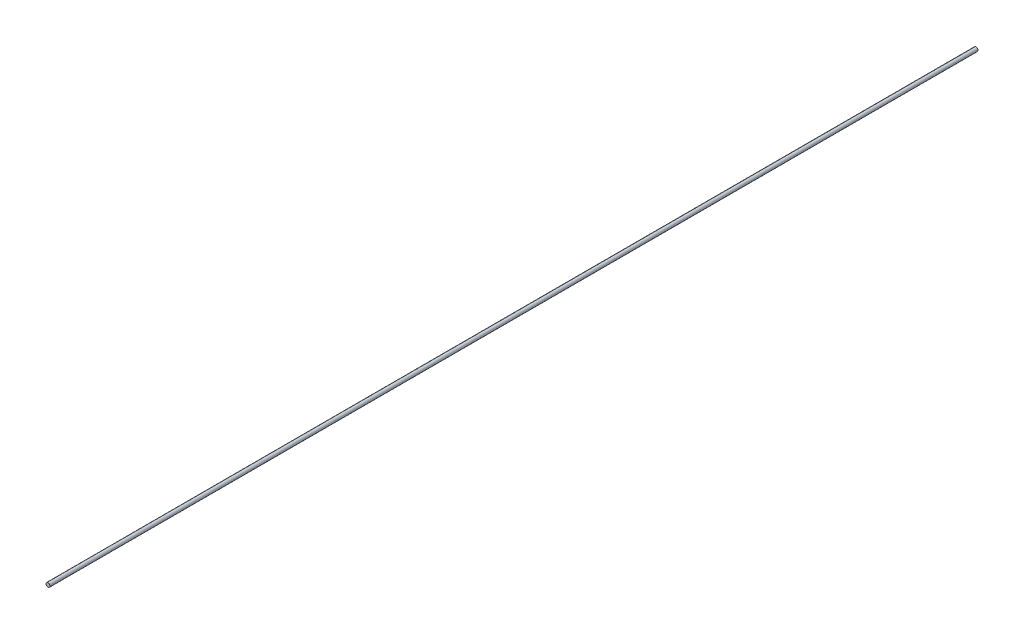
ISO-10303-21;
HEADER;
FILE_DESCRIPTION(('STEP AP214'),'2;1');
FILE_NAME('part.step','',(''),(''),'','','');
FILE_SCHEMA(('AUTOMOTIVE_DESIGN { 1 0 10303 214 1 1 1 1 }'));
ENDSEC;
DATA;
#1=APPLICATION_CONTEXT('core data for automotive mechanical design processes');
#2=APPLICATION_PROTOCOL_DEFINITION('international standard','automotive_design',2000,#1);
#3=PRODUCT_CONTEXT('',#1,'mechanical');
#4=PRODUCT('Part','Part','',(#3));
#5=PRODUCT_RELATED_PRODUCT_CATEGORY('part','',(#4));
#6=PRODUCT_DEFINITION_FORMATION('','',#4);
#7=PRODUCT_DEFINITION_CONTEXT('part definition',#1,'design');
#8=PRODUCT_DEFINITION('design','',#6,#7);
#9=PRODUCT_DEFINITION_SHAPE('','',#8);
#10=(LENGTH_UNIT() NAMED_UNIT(*) SI_UNIT(.MILLI.,.METRE.));
#11=(NAMED_UNIT(*) PLANE_ANGLE_UNIT() SI_UNIT($,.RADIAN.));
#12=(NAMED_UNIT(*) SI_UNIT($,.STERADIAN.) SOLID_ANGLE_UNIT());
#13=UNCERTAINTY_MEASURE_WITH_UNIT(LENGTH_MEASURE(1.E-05),#10,'distance_accuracy_value','');
#14=(GEOMETRIC_REPRESENTATION_CONTEXT(3) GLOBAL_UNCERTAINTY_ASSIGNED_CONTEXT((#13)) GLOBAL_UNIT_ASSIGNED_CONTEXT((#10,
#11,#12)) REPRESENTATION_CONTEXT('',''));
#15=CARTESIAN_POINT('',(0.,0.,0.));
#16=DIRECTION('',(0.,0.,1.));
#17=DIRECTION('',(1.,0.,0.));
#18=AXIS2_PLACEMENT_3D('',#15,#16,#17);
#19=CARTESIAN_POINT('',(0.,0.,934.05));
#20=DIRECTION('',(0.,0.,-1.));
#21=DIRECTION('',(-1.,0.,0.));
#22=AXIS2_PLACEMENT_3D('',#19,#20,#21);
#23=CYLINDRICAL_SURFACE('',#22,2.);
#24=CARTESIAN_POINT('',(0.,0.,934.05));
#25=DIRECTION('',(0.,0.,1.));
#26=DIRECTION('',(1.,0.,0.));
#27=AXIS2_PLACEMENT_3D('',#24,#25,#26);
#28=CIRCLE('',#27,2.);
#29=CARTESIAN_POINT('',(2.,0.,934.05));
#30=VERTEX_POINT('',#29);
#31=EDGE_CURVE('E10',#30,#30,#28,.T.);
#32=ORIENTED_EDGE('',*,*,#31,.F.);
#33=EDGE_LOOP('',(#32));
#34=FACE_BOUND('',#33,.T.);
#35=CARTESIAN_POINT('',(0.,0.,0.));
#36=DIRECTION('',(0.,0.,1.));
#37=DIRECTION('',(1.,0.,0.));
#38=AXIS2_PLACEMENT_3D('',#35,#36,#37);
#39=CIRCLE('',#38,2.);
#40=CARTESIAN_POINT('',(2.,0.,0.));
#41=VERTEX_POINT('',#40);
#42=EDGE_CURVE('E38',#41,#41,#39,.T.);
#43=ORIENTED_EDGE('',*,*,#42,.T.);
#44=EDGE_LOOP('',(#43));
#45=FACE_BOUND('',#44,.T.);
#46=ADVANCED_FACE('F35',(#34,#45),#23,.T.);
#47=CARTESIAN_POINT('',(0.,0.,934.05));
#48=DIRECTION('',(0.,0.,1.));
#49=DIRECTION('',(1.,0.,0.));
#50=AXIS2_PLACEMENT_3D('',#47,#48,#49);
#51=PLANE('',#50);
#52=ORIENTED_EDGE('',*,*,#31,.T.);
#53=EDGE_LOOP('',(#52));
#54=FACE_BOUND('',#53,.T.);
#55=ADVANCED_FACE('F50',(#54),#51,.T.);
#56=CARTESIAN_POINT('',(0.,0.,0.));
#57=DIRECTION('',(0.,0.,1.));
#58=DIRECTION('',(1.,0.,0.));
#59=AXIS2_PLACEMENT_3D('',#56,#57,#58);
#60=PLANE('',#59);
#61=ORIENTED_EDGE('',*,*,#42,.F.);
#62=EDGE_LOOP('',(#61));
#63=FACE_BOUND('',#62,.T.);
#64=ADVANCED_FACE('F48',(#63),#60,.F.);
#65=CLOSED_SHELL('',(#46,#55,#64));
#66=MANIFOLD_SOLID_BREP('B2',#65);
#67=ADVANCED_BREP_SHAPE_REPRESENTATION('',(#18,#66),#14);
#68=SHAPE_DEFINITION_REPRESENTATION(#9,#67);
ENDSEC;
END-ISO-10303-21;
